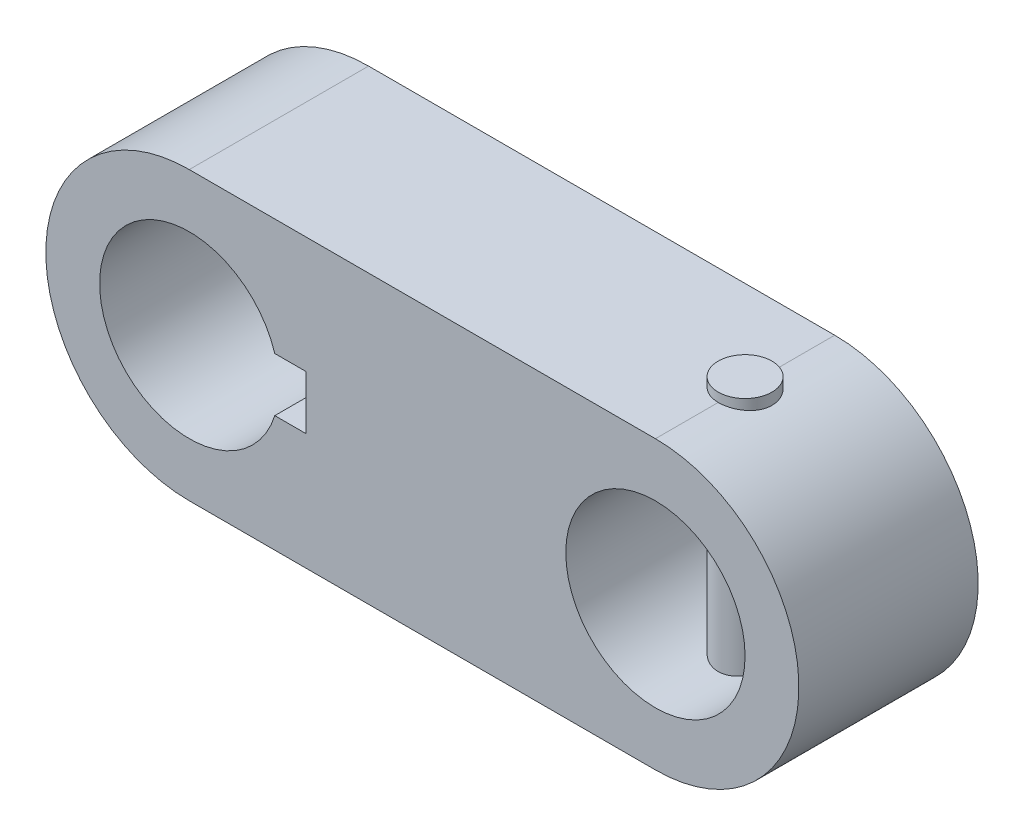
ISO-10303-21;
HEADER;
FILE_DESCRIPTION(('STEP AP214'),'2;1');
FILE_NAME('part.step','',(''),(''),'','','');
FILE_SCHEMA(('AUTOMOTIVE_DESIGN { 1 0 10303 214 1 1 1 1 }'));
ENDSEC;
DATA;
#1=APPLICATION_CONTEXT('core data for automotive mechanical design processes');
#2=APPLICATION_PROTOCOL_DEFINITION('international standard','automotive_design',2000,#1);
#3=PRODUCT_CONTEXT('',#1,'mechanical');
#4=PRODUCT('Part','Part','',(#3));
#5=PRODUCT_RELATED_PRODUCT_CATEGORY('part','',(#4));
#6=PRODUCT_DEFINITION_FORMATION('','',#4);
#7=PRODUCT_DEFINITION_CONTEXT('part definition',#1,'design');
#8=PRODUCT_DEFINITION('design','',#6,#7);
#9=PRODUCT_DEFINITION_SHAPE('','',#8);
#10=(LENGTH_UNIT() NAMED_UNIT(*) SI_UNIT(.MILLI.,.METRE.));
#11=(NAMED_UNIT(*) PLANE_ANGLE_UNIT() SI_UNIT($,.RADIAN.));
#12=(NAMED_UNIT(*) SI_UNIT($,.STERADIAN.) SOLID_ANGLE_UNIT());
#13=UNCERTAINTY_MEASURE_WITH_UNIT(LENGTH_MEASURE(1.E-05),#10,'distance_accuracy_value','');
#14=(GEOMETRIC_REPRESENTATION_CONTEXT(3) GLOBAL_UNCERTAINTY_ASSIGNED_CONTEXT((#13)) GLOBAL_UNIT_ASSIGNED_CONTEXT((#10,
#11,#12)) REPRESENTATION_CONTEXT('',''));
#15=CARTESIAN_POINT('',(0.,0.,0.));
#16=DIRECTION('',(0.,0.,1.));
#17=DIRECTION('',(1.,0.,0.));
#18=AXIS2_PLACEMENT_3D('',#15,#16,#17);
#19=CARTESIAN_POINT('',(13.,8.5,0.));
#20=DIRECTION('',(0.,-1.,0.));
#21=DIRECTION('',(0.,0.,-1.));
#22=AXIS2_PLACEMENT_3D('',#19,#20,#21);
#23=CYLINDRICAL_SURFACE('',#22,1.5);
#24=CARTESIAN_POINT('',(13.,8.5,0.));
#25=DIRECTION('',(0.,1.,0.));
#26=DIRECTION('',(0.,0.,1.));
#27=AXIS2_PLACEMENT_3D('',#24,#25,#26);
#28=CIRCLE('',#27,1.5);
#29=CARTESIAN_POINT('',(13.,8.5,1.5));
#30=VERTEX_POINT('',#29);
#31=EDGE_CURVE('E11',#30,#30,#28,.T.);
#32=ORIENTED_EDGE('',*,*,#31,.F.);
#33=EDGE_LOOP('',(#32));
#34=FACE_BOUND('',#33,.T.);
#35=CARTESIAN_POINT('',(13.,-8.5,0.));
#36=DIRECTION('',(0.,1.,0.));
#37=DIRECTION('',(0.,0.,1.));
#38=AXIS2_PLACEMENT_3D('',#35,#36,#37);
#39=CIRCLE('',#38,1.5);
#40=CARTESIAN_POINT('',(13.,-8.5,1.5));
#41=VERTEX_POINT('',#40);
#42=EDGE_CURVE('E47',#41,#41,#39,.T.);
#43=ORIENTED_EDGE('',*,*,#42,.T.);
#44=EDGE_LOOP('',(#43));
#45=FACE_BOUND('',#44,.T.);
#46=ADVANCED_FACE('F44',(#34,#45),#23,.T.);
#47=CARTESIAN_POINT('',(13.,8.5,0.));
#48=DIRECTION('',(0.,1.,0.));
#49=DIRECTION('',(0.,0.,1.));
#50=AXIS2_PLACEMENT_3D('',#47,#48,#49);
#51=PLANE('',#50);
#52=ORIENTED_EDGE('',*,*,#31,.T.);
#53=EDGE_LOOP('',(#52));
#54=FACE_BOUND('',#53,.T.);
#55=ADVANCED_FACE('F59',(#54),#51,.T.);
#56=CARTESIAN_POINT('',(13.,-8.5,0.));
#57=DIRECTION('',(0.,1.,0.));
#58=DIRECTION('',(0.,0.,1.));
#59=AXIS2_PLACEMENT_3D('',#56,#57,#58);
#60=PLANE('',#59);
#61=ORIENTED_EDGE('',*,*,#42,.F.);
#62=EDGE_LOOP('',(#61));
#63=FACE_BOUND('',#62,.T.);
#64=ADVANCED_FACE('F57',(#63),#60,.F.);
#65=CLOSED_SHELL('',(#46,#55,#64));
#66=MANIFOLD_SOLID_BREP('B2',#65);
#67=CARTESIAN_POINT('',(-13.,0.,5.));
#68=DIRECTION('',(0.,0.,-1.));
#69=DIRECTION('',(-1.,0.,0.));
#70=AXIS2_PLACEMENT_3D('',#67,#68,#69);
#71=PLANE('',#70);
#72=CARTESIAN_POINT('',(13.,0.,5.));
#73=DIRECTION('',(0.,0.,1.));
#74=DIRECTION('',(1.,0.,0.));
#75=AXIS2_PLACEMENT_3D('',#72,#73,#74);
#76=CIRCLE('',#75,5.);
#77=CARTESIAN_POINT('',(18.,0.,5.));
#78=VERTEX_POINT('',#77);
#79=EDGE_CURVE('E239',#78,#78,#76,.T.);
#80=ORIENTED_EDGE('',*,*,#79,.F.);
#81=EDGE_LOOP('',(#80));
#82=FACE_BOUND('',#81,.T.);
#83=CARTESIAN_POINT('',(-13.,0.,5.));
#84=DIRECTION('',(0.,0.,1.));
#85=DIRECTION('',(-1.,0.,0.));
#86=AXIS2_PLACEMENT_3D('',#83,#84,#85);
#87=CIRCLE('',#86,8.00000000000001);
#88=CARTESIAN_POINT('',(-12.9999999999999,7.99999999999999,5.));
#89=VERTEX_POINT('',#88);
#90=CARTESIAN_POINT('',(-13.,-8.00000000000003,5.));
#91=VERTEX_POINT('',#90);
#92=EDGE_CURVE('E243',#89,#91,#87,.T.);
#93=ORIENTED_EDGE('',*,*,#92,.T.);
#94=DIRECTION('',(1.,0.,0.));
#95=VECTOR('',#94,1.);
#96=CARTESIAN_POINT('',(13.,-8.00000000000003,5.));
#97=LINE('',#96,#95);
#98=CARTESIAN_POINT('',(13.,-8.00000000000003,5.));
#99=VERTEX_POINT('',#98);
#100=EDGE_CURVE('E288',#91,#99,#97,.T.);
#101=ORIENTED_EDGE('',*,*,#100,.T.);
#102=CARTESIAN_POINT('',(13.,0.,5.));
#103=DIRECTION('',(0.,0.,1.));
#104=DIRECTION('',(1.,0.,0.));
#105=AXIS2_PLACEMENT_3D('',#102,#103,#104);
#106=CIRCLE('',#105,8.00000000000001);
#107=CARTESIAN_POINT('',(13.,8.00000000000001,5.));
#108=VERTEX_POINT('',#107);
#109=EDGE_CURVE('E183',#99,#108,#106,.T.);
#110=ORIENTED_EDGE('',*,*,#109,.T.);
#111=DIRECTION('',(-1.,0.,0.));
#112=VECTOR('',#111,1.);
#113=CARTESIAN_POINT('',(13.,7.99999999999999,5.));
#114=LINE('',#113,#112);
#115=EDGE_CURVE('E292',#108,#89,#114,.T.);
#116=ORIENTED_EDGE('',*,*,#115,.T.);
#117=EDGE_LOOP('',(#93,#101,#110,#116));
#118=FACE_BOUND('',#117,.T.);
#119=DIRECTION('',(0.,1.,0.));
#120=VECTOR('',#119,1.);
#121=CARTESIAN_POINT('',(-6.50000000000003,1.5,5.));
#122=LINE('',#121,#120);
#123=CARTESIAN_POINT('',(-6.50000000000003,-1.5,5.));
#124=VERTEX_POINT('',#123);
#125=CARTESIAN_POINT('',(-6.50000000000003,1.5,5.));
#126=VERTEX_POINT('',#125);
#127=EDGE_CURVE('E248',#124,#126,#122,.T.);
#128=ORIENTED_EDGE('',*,*,#127,.F.);
#129=DIRECTION('',(1.,0.,0.));
#130=VECTOR('',#129,1.);
#131=CARTESIAN_POINT('',(-8.2303039929153,-1.5,5.));
#132=LINE('',#131,#130);
#133=CARTESIAN_POINT('',(-8.2303039929153,-1.5,5.));
#134=VERTEX_POINT('',#133);
#135=EDGE_CURVE('E250',#134,#124,#132,.T.);
#136=ORIENTED_EDGE('',*,*,#135,.F.);
#137=CARTESIAN_POINT('',(-13.,0.,5.));
#138=DIRECTION('',(0.,0.,1.));
#139=DIRECTION('',(1.,0.,0.));
#140=AXIS2_PLACEMENT_3D('',#137,#138,#139);
#141=CIRCLE('',#140,5.);
#142=CARTESIAN_POINT('',(-8.2303039929153,1.5,5.));
#143=VERTEX_POINT('',#142);
#144=EDGE_CURVE('E257',#143,#134,#141,.T.);
#145=ORIENTED_EDGE('',*,*,#144,.F.);
#146=DIRECTION('',(-1.,0.,0.));
#147=VECTOR('',#146,1.);
#148=CARTESIAN_POINT('',(-8.2303039929153,1.5,5.));
#149=LINE('',#148,#147);
#150=EDGE_CURVE('E251',#126,#143,#149,.T.);
#151=ORIENTED_EDGE('',*,*,#150,.F.);
#152=EDGE_LOOP('',(#128,#136,#145,#151));
#153=FACE_BOUND('',#152,.T.);
#154=ADVANCED_FACE('F84',(#82,#118,#153),#71,.F.);
#155=CARTESIAN_POINT('',(-13.,0.,-5.));
#156=DIRECTION('',(0.,0.,-1.));
#157=DIRECTION('',(-1.,0.,0.));
#158=AXIS2_PLACEMENT_3D('',#155,#156,#157);
#159=PLANE('',#158);
#160=CARTESIAN_POINT('',(-13.,0.,-5.));
#161=DIRECTION('',(0.,0.,1.));
#162=DIRECTION('',(-1.,0.,0.));
#163=AXIS2_PLACEMENT_3D('',#160,#161,#162);
#164=CIRCLE('',#163,8.00000000000001);
#165=CARTESIAN_POINT('',(-12.9999999999999,7.99999999999999,-5.));
#166=VERTEX_POINT('',#165);
#167=CARTESIAN_POINT('',(-13.,-8.00000000000003,-5.));
#168=VERTEX_POINT('',#167);
#169=EDGE_CURVE('E284',#166,#168,#164,.T.);
#170=ORIENTED_EDGE('',*,*,#169,.F.);
#171=DIRECTION('',(-1.,0.,0.));
#172=VECTOR('',#171,1.);
#173=CARTESIAN_POINT('',(13.,7.99999999999999,-5.));
#174=LINE('',#173,#172);
#175=CARTESIAN_POINT('',(13.,8.00000000000001,-5.));
#176=VERTEX_POINT('',#175);
#177=EDGE_CURVE('E289',#176,#166,#174,.T.);
#178=ORIENTED_EDGE('',*,*,#177,.F.);
#179=CARTESIAN_POINT('',(13.,0.,-5.));
#180=DIRECTION('',(0.,0.,1.));
#181=DIRECTION('',(1.,0.,0.));
#182=AXIS2_PLACEMENT_3D('',#179,#180,#181);
#183=CIRCLE('',#182,8.00000000000001);
#184=CARTESIAN_POINT('',(13.,-8.00000000000003,-5.));
#185=VERTEX_POINT('',#184);
#186=EDGE_CURVE('E299',#185,#176,#183,.T.);
#187=ORIENTED_EDGE('',*,*,#186,.F.);
#188=DIRECTION('',(1.,0.,0.));
#189=VECTOR('',#188,1.);
#190=CARTESIAN_POINT('',(13.,-8.00000000000003,-5.));
#191=LINE('',#190,#189);
#192=EDGE_CURVE('E297',#168,#185,#191,.T.);
#193=ORIENTED_EDGE('',*,*,#192,.F.);
#194=EDGE_LOOP('',(#170,#178,#187,#193));
#195=FACE_BOUND('',#194,.T.);
#196=CARTESIAN_POINT('',(13.,0.,-5.));
#197=DIRECTION('',(0.,0.,1.));
#198=DIRECTION('',(1.,0.,0.));
#199=AXIS2_PLACEMENT_3D('',#196,#197,#198);
#200=CIRCLE('',#199,5.);
#201=CARTESIAN_POINT('',(18.,0.,-5.));
#202=VERTEX_POINT('',#201);
#203=EDGE_CURVE('E282',#202,#202,#200,.T.);
#204=ORIENTED_EDGE('',*,*,#203,.T.);
#205=EDGE_LOOP('',(#204));
#206=FACE_BOUND('',#205,.T.);
#207=DIRECTION('',(1.,0.,0.));
#208=VECTOR('',#207,1.);
#209=CARTESIAN_POINT('',(-8.2303039929153,-1.5,-5.));
#210=LINE('',#209,#208);
#211=CARTESIAN_POINT('',(-8.2303039929153,-1.5,-5.));
#212=VERTEX_POINT('',#211);
#213=CARTESIAN_POINT('',(-6.50000000000003,-1.5,-5.));
#214=VERTEX_POINT('',#213);
#215=EDGE_CURVE('E256',#212,#214,#210,.T.);
#216=ORIENTED_EDGE('',*,*,#215,.T.);
#217=DIRECTION('',(0.,1.,0.));
#218=VECTOR('',#217,1.);
#219=CARTESIAN_POINT('',(-6.50000000000003,1.5,-5.));
#220=LINE('',#219,#218);
#221=CARTESIAN_POINT('',(-6.50000000000003,1.5,-5.));
#222=VERTEX_POINT('',#221);
#223=EDGE_CURVE('E170',#214,#222,#220,.T.);
#224=ORIENTED_EDGE('',*,*,#223,.T.);
#225=DIRECTION('',(-1.,0.,0.));
#226=VECTOR('',#225,1.);
#227=CARTESIAN_POINT('',(-8.2303039929153,1.5,-5.));
#228=LINE('',#227,#226);
#229=CARTESIAN_POINT('',(-8.2303039929153,1.5,-5.));
#230=VERTEX_POINT('',#229);
#231=EDGE_CURVE('E269',#222,#230,#228,.T.);
#232=ORIENTED_EDGE('',*,*,#231,.T.);
#233=CARTESIAN_POINT('',(-13.,0.,-5.));
#234=DIRECTION('',(0.,0.,1.));
#235=DIRECTION('',(1.,0.,0.));
#236=AXIS2_PLACEMENT_3D('',#233,#234,#235);
#237=CIRCLE('',#236,5.);
#238=EDGE_CURVE('E260',#230,#212,#237,.T.);
#239=ORIENTED_EDGE('',*,*,#238,.T.);
#240=EDGE_LOOP('',(#216,#224,#232,#239));
#241=FACE_BOUND('',#240,.T.);
#242=ADVANCED_FACE('F228',(#195,#206,#241),#159,.T.);
#243=CARTESIAN_POINT('',(-13.,0.,5.));
#244=DIRECTION('',(0.,0.,-1.));
#245=DIRECTION('',(-1.,0.,0.));
#246=AXIS2_PLACEMENT_3D('',#243,#244,#245);
#247=CYLINDRICAL_SURFACE('',#246,8.00000000000001);
#248=ORIENTED_EDGE('',*,*,#169,.T.);
#249=DIRECTION('',(0.,0.,-1.));
#250=VECTOR('',#249,1.);
#251=CARTESIAN_POINT('',(-13.,-8.00000000000003,5.));
#252=LINE('',#251,#250);
#253=EDGE_CURVE('E42',#91,#168,#252,.T.);
#254=ORIENTED_EDGE('',*,*,#253,.F.);
#255=ORIENTED_EDGE('',*,*,#92,.F.);
#256=DIRECTION('',(0.,0.,-1.));
#257=VECTOR('',#256,1.);
#258=CARTESIAN_POINT('',(-12.9999999999999,7.99999999999999,5.));
#259=LINE('',#258,#257);
#260=EDGE_CURVE('E294',#89,#166,#259,.T.);
#261=ORIENTED_EDGE('',*,*,#260,.T.);
#262=EDGE_LOOP('',(#248,#254,#255,#261));
#263=FACE_BOUND('',#262,.T.);
#264=ADVANCED_FACE('F86',(#263),#247,.T.);
#265=CARTESIAN_POINT('',(13.,-8.00000000000003,5.));
#266=DIRECTION('',(0.,1.,0.));
#267=DIRECTION('',(0.,0.,1.));
#268=AXIS2_PLACEMENT_3D('',#265,#266,#267);
#269=PLANE('',#268);
#270=DIRECTION('',(0.,0.,-1.));
#271=VECTOR('',#270,1.);
#272=CARTESIAN_POINT('',(13.,-8.00000000000003,5.));
#273=LINE('',#272,#271);
#274=CARTESIAN_POINT('',(13.,-8.00000000000003,-1.5));
#275=VERTEX_POINT('',#274);
#276=EDGE_CURVE('E177',#275,#185,#273,.T.);
#277=ORIENTED_EDGE('',*,*,#276,.F.);
#278=CARTESIAN_POINT('',(13.,-8.00000000000003,0.));
#279=DIRECTION('',(0.,1.,0.));
#280=DIRECTION('',(0.,0.,1.));
#281=AXIS2_PLACEMENT_3D('',#278,#279,#280);
#282=CIRCLE('',#281,1.5);
#283=CARTESIAN_POINT('',(13.,-8.00000000000003,1.5));
#284=VERTEX_POINT('',#283);
#285=EDGE_CURVE('E105',#275,#284,#282,.T.);
#286=ORIENTED_EDGE('',*,*,#285,.T.);
#287=EDGE_CURVE('E98',#99,#284,#273,.T.);
#288=ORIENTED_EDGE('',*,*,#287,.F.);
#289=ORIENTED_EDGE('',*,*,#100,.F.);
#290=ORIENTED_EDGE('',*,*,#253,.T.);
#291=ORIENTED_EDGE('',*,*,#192,.T.);
#292=EDGE_LOOP('',(#277,#286,#288,#289,#290,#291));
#293=FACE_BOUND('',#292,.T.);
#294=ADVANCED_FACE('F174',(#293),#269,.F.);
#295=CARTESIAN_POINT('',(13.,0.,5.));
#296=DIRECTION('',(0.,0.,-1.));
#297=DIRECTION('',(-1.,0.,0.));
#298=AXIS2_PLACEMENT_3D('',#295,#296,#297);
#299=CYLINDRICAL_SURFACE('',#298,8.00000000000001);
#300=ORIENTED_EDGE('',*,*,#287,.T.);
#301=CARTESIAN_POINT('',(13.,-8.00000000000001,1.5));
#302=CARTESIAN_POINT('',(13.0418117649847,-8.00000181621951,1.50000014418277));
#303=CARTESIAN_POINT('',(13.0836031516983,-7.99967179974463,1.49825066820148));
#304=CARTESIAN_POINT('',(13.1668798947577,-7.99836740024411,1.49127408384776));
#305=CARTESIAN_POINT('',(13.2083652843394,-7.99739308827258,1.48604735895251));
#306=CARTESIAN_POINT('',(13.331790086588,-7.9935384229809,1.46521493517393));
#307=CARTESIAN_POINT('',(13.4128916798455,-7.98972616594016,1.44445675593208));
#308=CARTESIAN_POINT('',(13.5703818625236,-7.98003191449903,1.38982854106838));
#309=CARTESIAN_POINT('',(13.6467696396282,-7.97414956453072,1.35595625281145));
#310=CARTESIAN_POINT('',(13.7927945330153,-7.96095806061461,1.27608762842633));
#311=CARTESIAN_POINT('',(13.8624312680283,-7.95364882615276,1.23009060809108));
#312=CARTESIAN_POINT('',(13.9937817658913,-7.93831372866161,1.12670254791103));
#313=CARTESIAN_POINT('',(14.0554036207782,-7.93028108465622,1.06919578876815));
#314=CARTESIAN_POINT('',(14.168191109011,-7.91445389199043,0.944662815450613));
#315=CARTESIAN_POINT('',(14.2193550394567,-7.90665938228175,0.877635053944912));
#316=CARTESIAN_POINT('',(14.3101513463827,-7.89212530831058,0.735311897907003));
#317=CARTESIAN_POINT('',(14.3496894614751,-7.88539456161013,0.659955390403306));
#318=CARTESIAN_POINT('',(14.4155067016361,-7.87384686023794,0.503526530397418));
#319=CARTESIAN_POINT('',(14.4417877122026,-7.86902963343565,0.422454992588525));
#320=CARTESIAN_POINT('',(14.4800503149573,-7.86192273775921,0.257885737327923));
#321=CARTESIAN_POINT('',(14.4921936177075,-7.85960450794487,0.17442687568149));
#322=CARTESIAN_POINT('',(14.5023381254315,-7.85767196290833,0.00662460729517247));
#323=CARTESIAN_POINT('',(14.5003402657489,-7.85805746885204,-0.0777187405733906));
#324=CARTESIAN_POINT('',(14.4823897670708,-7.86146293283626,-0.243719813057314));
#325=CARTESIAN_POINT('',(14.4666213959002,-7.86444810243881,-0.3253982825955));
#326=CARTESIAN_POINT('',(14.4218677868559,-7.87266186895027,-0.484928960662143));
#327=CARTESIAN_POINT('',(14.3928820789168,-7.87789054564758,-0.562781032998307));
#328=CARTESIAN_POINT('',(14.3223358879413,-7.8900386576452,-0.712989968438327));
#329=CARTESIAN_POINT('',(14.2807007908968,-7.89696807707177,-0.78531094776666));
#330=CARTESIAN_POINT('',(14.1860917834088,-7.91172998449056,-0.922006947502028));
#331=CARTESIAN_POINT('',(14.1331171101961,-7.91956253321644,-0.986381432919699));
#332=CARTESIAN_POINT('',(14.0163471767891,-7.93539895799282,-1.10641692391779));
#333=CARTESIAN_POINT('',(13.9523956100839,-7.9434035974396,-1.16192586818196));
#334=CARTESIAN_POINT('',(13.8159860964121,-7.95857194445492,-1.26146558585217));
#335=CARTESIAN_POINT('',(13.7435258172145,-7.96573542038013,-1.30549320153501));
#336=CARTESIAN_POINT('',(13.5919870014908,-7.97842982988792,-1.38084362585212));
#337=CARTESIAN_POINT('',(13.5128967456907,-7.98395779094116,-1.41214333985005));
#338=CARTESIAN_POINT('',(13.3505067690563,-7.99272942715529,-1.46092721743504));
#339=CARTESIAN_POINT('',(13.2672134831227,-7.99597648710378,-1.47843185721709));
#340=CARTESIAN_POINT('',(13.1527227143554,-7.99860062541004,-1.49252108318509));
#341=CARTESIAN_POINT('',(13.1222210188174,-7.99912490932021,-1.49532674607047));
#342=CARTESIAN_POINT('',(13.0611507436226,-7.99982426899377,-1.4990638109804));
#343=CARTESIAN_POINT('',(13.030582364102,-7.99999993339314,-1.49999837234019));
#344=CARTESIAN_POINT('',(13.,-8.00000000000001,-1.5));
#345=B_SPLINE_CURVE_WITH_KNOTS('',3,(#301,#302,#303,#304,#305,#306,#307,#308,#309,#310,#311,
#312,#313,#314,#315,#316,#317,#318,#319,#320,#321,#322,#323,#324,#325,#326,#327,#328,#329,#330,
#331,#332,#333,#334,#335,#336,#337,#338,#339,#340,#341,#342,#343,#344),.UNSPECIFIED.,.F.,.F.,(4,
2,2,2,2,2,2,2,2,2,2,2,2,2,2,2,2,2,2,2,2,4),(0.,0.125357130470065,0.250700438624284,
0.500813903064926,0.750970349038626,1.00114091453767,1.25396595140187,1.50683212391074,
1.76169530333673,2.01652222449957,2.26840481095869,2.52027073722333,2.76881712846962,
3.0173723597877,3.26742316812927,3.51749080170847,3.77147032935619,4.02551963579423,
4.28002787679103,4.53415763286603,4.62601728280353,4.71772169743777),.UNSPECIFIED.);
#346=EDGE_CURVE('E165',#284,#275,#345,.T.);
#347=ORIENTED_EDGE('',*,*,#346,.T.);
#348=ORIENTED_EDGE('',*,*,#276,.T.);
#349=ORIENTED_EDGE('',*,*,#186,.T.);
#350=DIRECTION('',(0.,0.,-1.));
#351=VECTOR('',#350,1.);
#352=CARTESIAN_POINT('',(13.,8.00000000000001,5.));
#353=LINE('',#352,#351);
#354=CARTESIAN_POINT('',(13.,7.99999999999999,-1.5));
#355=VERTEX_POINT('',#354);
#356=EDGE_CURVE('E303',#355,#176,#353,.T.);
#357=ORIENTED_EDGE('',*,*,#356,.F.);
#358=CARTESIAN_POINT('',(13.,8.00000000000001,-1.5));
#359=CARTESIAN_POINT('',(13.0418117649847,8.00000181621951,-1.50000014418277));
#360=CARTESIAN_POINT('',(13.0836031516983,7.99967179974463,-1.49825066820148));
#361=CARTESIAN_POINT('',(13.1668798947577,7.99836740024411,-1.49127408384776));
#362=CARTESIAN_POINT('',(13.2083652843393,7.99739308827258,-1.48604735895251));
#363=CARTESIAN_POINT('',(13.331790086588,7.9935384229809,-1.46521493517393));
#364=CARTESIAN_POINT('',(13.4128916798455,7.98972616594016,-1.44445675593208));
#365=CARTESIAN_POINT('',(13.5703818625236,7.98003191449903,-1.38982854106838));
#366=CARTESIAN_POINT('',(13.6467696396282,7.97414956453072,-1.35595625281145));
#367=CARTESIAN_POINT('',(13.7927945330153,7.96095806061461,-1.27608762842633));
#368=CARTESIAN_POINT('',(13.8624312680283,7.95364882615276,-1.23009060809108));
#369=CARTESIAN_POINT('',(13.9937817658913,7.93831372866161,-1.12670254791103));
#370=CARTESIAN_POINT('',(14.0554036207782,7.93028108465622,-1.06919578876815));
#371=CARTESIAN_POINT('',(14.168191109011,7.91445389199043,-0.944662815450614));
#372=CARTESIAN_POINT('',(14.2193550394567,7.90665938228175,-0.877635053944913));
#373=CARTESIAN_POINT('',(14.3101513463827,7.89212530831058,-0.735311897907004));
#374=CARTESIAN_POINT('',(14.3496894614751,7.88539456161013,-0.659955390403307));
#375=CARTESIAN_POINT('',(14.4155067016361,7.87384686023794,-0.50352653039742));
#376=CARTESIAN_POINT('',(14.4417877122026,7.86902963343565,-0.422454992588527));
#377=CARTESIAN_POINT('',(14.4800503149573,7.86192273775921,-0.257885737327925));
#378=CARTESIAN_POINT('',(14.4921936177075,7.85960450794487,-0.174426875681492));
#379=CARTESIAN_POINT('',(14.5023381254315,7.85767196290833,-0.00662460729517455));
#380=CARTESIAN_POINT('',(14.5003402657489,7.85805746885204,0.0777187405733885));
#381=CARTESIAN_POINT('',(14.4823897670708,7.86146293283626,0.243719813057311));
#382=CARTESIAN_POINT('',(14.4666213959002,7.86444810243881,0.325398282595498));
#383=CARTESIAN_POINT('',(14.4218677868559,7.87266186895027,0.484928960662141));
#384=CARTESIAN_POINT('',(14.3928820789168,7.87789054564758,0.562781032998305));
#385=CARTESIAN_POINT('',(14.3223358879413,7.8900386576452,0.712989968438325));
#386=CARTESIAN_POINT('',(14.2807007908968,7.89696807707177,0.785310947766658));
#387=CARTESIAN_POINT('',(14.1860917834088,7.91172998449056,0.922006947502027));
#388=CARTESIAN_POINT('',(14.1331171101961,7.91956253321644,0.986381432919697));
#389=CARTESIAN_POINT('',(14.0163471767891,7.93539895799282,1.10641692391779));
#390=CARTESIAN_POINT('',(13.9523956100839,7.9434035974396,1.16192586818196));
#391=CARTESIAN_POINT('',(13.8159860964121,7.95857194445492,1.26146558585217));
#392=CARTESIAN_POINT('',(13.7435258172145,7.96573542038013,1.30549320153501));
#393=CARTESIAN_POINT('',(13.5919870014908,7.97842982988792,1.38084362585212));
#394=CARTESIAN_POINT('',(13.5128967456907,7.98395779094116,1.41214333985004));
#395=CARTESIAN_POINT('',(13.3505067690563,7.99272942715529,1.46092721743504));
#396=CARTESIAN_POINT('',(13.2672134831227,7.99597648710378,1.47843185721709));
#397=CARTESIAN_POINT('',(13.1527227143554,7.99860062541004,1.49252108318509));
#398=CARTESIAN_POINT('',(13.1222210188174,7.99912490932021,1.49532674607047));
#399=CARTESIAN_POINT('',(13.0611507436226,7.99982426899377,1.4990638109804));
#400=CARTESIAN_POINT('',(13.030582364102,7.99999993339314,1.49999837234019));
#401=CARTESIAN_POINT('',(13.,8.00000000000001,1.5));
#402=B_SPLINE_CURVE_WITH_KNOTS('',3,(#358,#359,#360,#361,#362,#363,#364,#365,#366,#367,#368,
#369,#370,#371,#372,#373,#374,#375,#376,#377,#378,#379,#380,#381,#382,#383,#384,#385,#386,#387,
#388,#389,#390,#391,#392,#393,#394,#395,#396,#397,#398,#399,#400,#401),.UNSPECIFIED.,.F.,.F.,(4,
2,2,2,2,2,2,2,2,2,2,2,2,2,2,2,2,2,2,2,2,4),(0.,0.125357130470063,0.250700438624283,
0.500813903064926,0.750970349038626,1.00114091453767,1.25396595140187,1.50683212391074,
1.76169530333673,2.01652222449957,2.26840481095869,2.52027073722333,2.76881712846962,
3.0173723597877,3.26742316812927,3.51749080170847,3.77147032935619,4.02551963579423,
4.28002787679103,4.53415763286603,4.62601728280353,4.71772169743777),.UNSPECIFIED.);
#403=CARTESIAN_POINT('',(13.,8.00000000000001,1.5));
#404=VERTEX_POINT('',#403);
#405=EDGE_CURVE('E112',#355,#404,#402,.T.);
#406=ORIENTED_EDGE('',*,*,#405,.T.);
#407=EDGE_CURVE('E185',#108,#404,#353,.T.);
#408=ORIENTED_EDGE('',*,*,#407,.F.);
#409=ORIENTED_EDGE('',*,*,#109,.F.);
#410=EDGE_LOOP('',(#300,#347,#348,#349,#357,#406,#408,#409));
#411=FACE_BOUND('',#410,.T.);
#412=ADVANCED_FACE('F181',(#411),#299,.T.);
#413=CARTESIAN_POINT('',(13.,7.99999999999999,5.));
#414=DIRECTION('',(0.,-1.,0.));
#415=DIRECTION('',(0.,0.,-1.));
#416=AXIS2_PLACEMENT_3D('',#413,#414,#415);
#417=PLANE('',#416);
#418=ORIENTED_EDGE('',*,*,#407,.T.);
#419=CARTESIAN_POINT('',(13.,8.00000000000001,0.));
#420=DIRECTION('',(0.,1.,0.));
#421=DIRECTION('',(0.,0.,1.));
#422=AXIS2_PLACEMENT_3D('',#419,#420,#421);
#423=CIRCLE('',#422,1.5);
#424=EDGE_CURVE('E179',#355,#404,#423,.T.);
#425=ORIENTED_EDGE('',*,*,#424,.F.);
#426=ORIENTED_EDGE('',*,*,#356,.T.);
#427=ORIENTED_EDGE('',*,*,#177,.T.);
#428=ORIENTED_EDGE('',*,*,#260,.F.);
#429=ORIENTED_EDGE('',*,*,#115,.F.);
#430=EDGE_LOOP('',(#418,#425,#426,#427,#428,#429));
#431=FACE_BOUND('',#430,.T.);
#432=ADVANCED_FACE('F221',(#431),#417,.F.);
#433=CARTESIAN_POINT('',(13.,0.,5.));
#434=DIRECTION('',(0.,0.,-1.));
#435=DIRECTION('',(-1.,0.,0.));
#436=AXIS2_PLACEMENT_3D('',#433,#434,#435);
#437=CYLINDRICAL_SURFACE('',#436,5.);
#438=CARTESIAN_POINT('',(13.,-5.,1.5));
#439=CARTESIAN_POINT('',(13.0822886127533,-4.9999992925055,1.49999900251511));
#440=CARTESIAN_POINT('',(13.1645873183515,-4.99794915693954,1.49320613637603));
#441=CARTESIAN_POINT('',(13.3267881253048,-4.98997105593691,1.4662786457779));
#442=CARTESIAN_POINT('',(13.4066895044114,-4.98404193389692,1.44614004197666));
#443=CARTESIAN_POINT('',(13.5617327077545,-4.96895552501836,1.39325398308974));
#444=CARTESIAN_POINT('',(13.6368813643953,-4.95980300250425,1.36052513038106));
#445=CARTESIAN_POINT('',(13.7806241810531,-4.93922109237645,1.28346390694416));
#446=CARTESIAN_POINT('',(13.8492174674696,-4.92779140192067,1.23912999260458));
#447=CARTESIAN_POINT('',(13.9798717971837,-4.90350737192774,1.13877599252733));
#448=CARTESIAN_POINT('',(14.0417180712443,-4.89062383657036,1.08248337411409));
#449=CARTESIAN_POINT('',(14.1552492092332,-4.86505834210442,0.960390770089817));
#450=CARTESIAN_POINT('',(14.2069323632744,-4.85237641724501,0.894589187875041));
#451=CARTESIAN_POINT('',(14.299800377237,-4.82834113993772,0.753529246962389));
#452=CARTESIAN_POINT('',(14.3407230902221,-4.81702406663875,0.678091539009263));
#453=CARTESIAN_POINT('',(14.4092139477476,-4.79743620394031,0.521010745769708));
#454=CARTESIAN_POINT('',(14.4367852991997,-4.78916468313311,0.439369156072026));
#455=CARTESIAN_POINT('',(14.4770163368265,-4.77690870838434,0.274609733869542));
#456=CARTESIAN_POINT('',(14.4900719623467,-4.77281069324533,0.191597256136058));
#457=CARTESIAN_POINT('',(14.5021373061467,-4.76902789749767,0.024466843783235));
#458=CARTESIAN_POINT('',(14.5011504276108,-4.76934204760571,-0.059650818059087));
#459=CARTESIAN_POINT('',(14.4854697719981,-4.77424744067778,-0.223383908608483));
#460=CARTESIAN_POINT('',(14.4712720526268,-4.7786838859914,-0.303052250362238));
#461=CARTESIAN_POINT('',(14.4303742042705,-4.79108356228624,-0.45881978627346));
#462=CARTESIAN_POINT('',(14.4036728414164,-4.79904714132351,-0.534918627374332));
#463=CARTESIAN_POINT('',(14.3381602665368,-4.81772733074973,-0.682600349660739));
#464=CARTESIAN_POINT('',(14.2991881693464,-4.82848016115952,-0.754107083955262));
#465=CARTESIAN_POINT('',(14.2103522258868,-4.85150987000065,-0.889732022010192));
#466=CARTESIAN_POINT('',(14.1604857400259,-4.86378711746991,-0.953848429413777));
#467=CARTESIAN_POINT('',(14.0488129076554,-4.88911011297937,-1.07568619076202));
#468=CARTESIAN_POINT('',(13.9865949074669,-4.90216654310498,-1.13302866402967));
#469=CARTESIAN_POINT('',(13.8532632593139,-4.92712244063259,-1.23655398406425));
#470=CARTESIAN_POINT('',(13.7821490518609,-4.9390218351841,-1.28273612841443));
#471=CARTESIAN_POINT('',(13.6323550383428,-4.9604316006947,-1.36285992246473));
#472=CARTESIAN_POINT('',(13.5536277497479,-4.96992543668314,-1.39671751624986));
#473=CARTESIAN_POINT('',(13.3912454156035,-4.98533521832222,-1.45059959009963));
#474=CARTESIAN_POINT('',(13.3075917515896,-4.99125216186999,-1.47062792853249));
#475=CARTESIAN_POINT('',(13.1409522426683,-4.99868364643538,-1.49565217789939));
#476=CARTESIAN_POINT('',(13.0580500976012,-5.0003485041779,-1.50116158580161));
#477=CARTESIAN_POINT('',(12.8925003941766,-4.9995292324176,-1.49843084428792));
#478=CARTESIAN_POINT('',(12.8098528033092,-4.99704565677756,-1.49019253034856));
#479=CARTESIAN_POINT('',(12.6490963946903,-4.98830696987163,-1.4606153888885));
#480=CARTESIAN_POINT('',(12.5709272273858,-4.98213829799417,-1.43957661241913));
#481=CARTESIAN_POINT('',(12.4192453610454,-4.96674347841533,-1.3853567672218));
#482=CARTESIAN_POINT('',(12.3457332229744,-4.95751696321085,-1.35217423896214));
#483=CARTESIAN_POINT('',(12.2035628105389,-4.93669654351325,-1.27374683451887));
#484=CARTESIAN_POINT('',(12.1350561738003,-4.92505280829675,-1.22824065905203));
#485=CARTESIAN_POINT('',(12.0064766920198,-4.90073468764318,-1.12677524594719));
#486=CARTESIAN_POINT('',(11.946405967644,-4.8880600443108,-1.07081338811233));
#487=CARTESIAN_POINT('',(11.8341425544897,-4.86253171869138,-0.947612691630656));
#488=CARTESIAN_POINT('',(11.7823151876849,-4.84968825033268,-0.880038124228265));
#489=CARTESIAN_POINT('',(11.6907100492784,-4.82576515238464,-0.736872060986469));
#490=CARTESIAN_POINT('',(11.6509319617053,-4.81468547654651,-0.661280775441787));
#491=CARTESIAN_POINT('',(11.5848265287283,-4.79567189615055,-0.504467508745313));
#492=CARTESIAN_POINT('',(11.5584365306295,-4.78772337843827,-0.42327381346341));
#493=CARTESIAN_POINT('',(11.5197826918488,-4.77591594362794,-0.257312031068523));
#494=CARTESIAN_POINT('',(11.5075140102122,-4.772055625083,-0.172545179212332));
#495=CARTESIAN_POINT('',(11.4977801551494,-4.76899972496087,-0.00563848162377307));
#496=CARTESIAN_POINT('',(11.4997194469151,-4.76961647442754,0.0764636510175854));
#497=CARTESIAN_POINT('',(11.5169249455518,-4.77499401288294,0.2391141033728));
#498=CARTESIAN_POINT('',(11.5321906187528,-4.77975463592551,0.319662485176353));
#499=CARTESIAN_POINT('',(11.5752311119586,-4.79275763670385,0.475945399142851));
#500=CARTESIAN_POINT('',(11.6028482449293,-4.80095604545965,0.551727287361693));
#501=CARTESIAN_POINT('',(11.6696849287887,-4.81990278909136,0.697642438817723));
#502=CARTESIAN_POINT('',(11.7089067003712,-4.83065161194312,0.767774617640756));
#503=CARTESIAN_POINT('',(11.7995123619492,-4.85397676425833,0.903163116527112));
#504=CARTESIAN_POINT('',(11.85128723907,-4.86660540163798,0.968148761260411));
#505=CARTESIAN_POINT('',(11.9648256537022,-4.89201320450026,1.08870249830786));
#506=CARTESIAN_POINT('',(12.0265917828655,-4.90479240823905,1.14426813946776));
#507=CARTESIAN_POINT('',(12.1605342378167,-4.92950936570649,1.24602341229503));
#508=CARTESIAN_POINT('',(12.2329621142094,-4.94141159765674,1.29189144685549));
#509=CARTESIAN_POINT('',(12.3848586260164,-4.96260680455813,1.37073516990402));
#510=CARTESIAN_POINT('',(12.464323947001,-4.97190099931067,1.40371688827451));
#511=CARTESIAN_POINT('',(12.6192422873447,-4.98602174969301,1.45289527565275));
#512=CARTESIAN_POINT('',(12.6942130380457,-4.99122027381068,1.47051167288325));
#513=CARTESIAN_POINT('',(12.8461198047692,-4.99820944494492,1.49406352524158));
#514=CARTESIAN_POINT('',(12.9230554901418,-5.0000006615474,1.50000093270482));
#515=CARTESIAN_POINT('',(13.,-5.,1.5));
#516=B_SPLINE_CURVE_WITH_KNOTS('',3,(#438,#439,#440,#441,#442,#443,#444,#445,#446,#447,#448,
#449,#450,#451,#452,#453,#454,#455,#456,#457,#458,#459,#460,#461,#462,#463,#464,#465,#466,#467,
#468,#469,#470,#471,#472,#473,#474,#475,#476,#477,#478,#479,#480,#481,#482,#483,#484,#485,#486,
#487,#488,#489,#490,#491,#492,#493,#494,#495,#496,#497,#498,#499,#500,#501,#502,#503,#504,#505,
#506,#507,#508,#509,#510,#511,#512,#513,#514,#515),.UNSPECIFIED.,.T.,.F.,(4,2,2,2,2,2,2,2,2,2,2,
2,2,2,2,2,2,2,2,2,2,2,2,2,2,2,2,2,2,2,2,2,2,2,2,2,2,2,4),(0.,0.246583203612609,
0.493239964845999,0.739533676300875,0.985860164412702,1.23855602948191,1.49129437288633,
1.74971481004109,2.00807314543224,2.25919689356599,2.51025978319089,2.75226016697676,
2.99428443658001,3.23962426447119,3.48502360158555,3.74067104048167,3.99633456531071,
4.25371046881688,4.51101453528808,4.75908809438545,5.00712853550327,5.24956746682327,
5.49203554593728,5.74011305702908,5.98825282000191,6.24540400322818,6.5025484425268,
6.75847814951252,7.01432009460283,7.25950155466943,7.504673196616,7.74680040402721,
7.98897397553107,8.23996925679931,8.49102974897502,8.74942996156671,9.00770911595235,
9.2383169193046,9.46888616948875),.UNSPECIFIED.);
#517=CARTESIAN_POINT('',(13.,-5.,1.5));
#518=VERTEX_POINT('',#517);
#519=EDGE_CURVE('E88',#518,#518,#516,.T.);
#520=ORIENTED_EDGE('',*,*,#519,.F.);
#521=EDGE_LOOP('',(#520));
#522=FACE_BOUND('',#521,.T.);
#523=CARTESIAN_POINT('',(13.,5.,1.5));
#524=CARTESIAN_POINT('',(12.9177113872467,4.9999992925055,1.49999900251511));
#525=CARTESIAN_POINT('',(12.8354126816484,4.99794915693954,1.49320613637603));
#526=CARTESIAN_POINT('',(12.6732118746951,4.98997105593691,1.4662786457779));
#527=CARTESIAN_POINT('',(12.5933104955886,4.98404193389692,1.44614004197666));
#528=CARTESIAN_POINT('',(12.4382672922454,4.96895552501836,1.39325398308974));
#529=CARTESIAN_POINT('',(12.3631186356046,4.95980300250425,1.36052513038106));
#530=CARTESIAN_POINT('',(12.2193758189468,4.93922109237645,1.28346390694416));
#531=CARTESIAN_POINT('',(12.1507825325303,4.92779140192067,1.23912999260458));
#532=CARTESIAN_POINT('',(12.0201282028162,4.90350737192774,1.13877599252733));
#533=CARTESIAN_POINT('',(11.9582819287556,4.89062383657036,1.08248337411409));
#534=CARTESIAN_POINT('',(11.8447507907667,4.86505834210442,0.960390770089817));
#535=CARTESIAN_POINT('',(11.7930676367256,4.85237641724501,0.894589187875041));
#536=CARTESIAN_POINT('',(11.7001996227629,4.82834113993772,0.753529246962389));
#537=CARTESIAN_POINT('',(11.6592769097778,4.81702406663875,0.678091539009263));
#538=CARTESIAN_POINT('',(11.5907860522524,4.79743620394031,0.521010745769708));
#539=CARTESIAN_POINT('',(11.5632147008002,4.78916468313311,0.439369156072026));
#540=CARTESIAN_POINT('',(11.5229836631735,4.77690870838434,0.274609733869542));
#541=CARTESIAN_POINT('',(11.5099280376532,4.77281069324533,0.191597256136058));
#542=CARTESIAN_POINT('',(11.4978626938532,4.76902789749767,0.024466843783235));
#543=CARTESIAN_POINT('',(11.4988495723892,4.76934204760571,-0.059650818059087));
#544=CARTESIAN_POINT('',(11.5145302280019,4.77424744067778,-0.223383908608483));
#545=CARTESIAN_POINT('',(11.5287279473731,4.7786838859914,-0.303052250362238));
#546=CARTESIAN_POINT('',(11.5696257957294,4.79108356228624,-0.45881978627346));
#547=CARTESIAN_POINT('',(11.5963271585836,4.79904714132351,-0.534918627374332));
#548=CARTESIAN_POINT('',(11.6618397334632,4.81772733074973,-0.682600349660739));
#549=CARTESIAN_POINT('',(11.7008118306535,4.82848016115952,-0.754107083955262));
#550=CARTESIAN_POINT('',(11.7896477741131,4.85150987000065,-0.889732022010192));
#551=CARTESIAN_POINT('',(11.8395142599741,4.86378711746991,-0.953848429413777));
#552=CARTESIAN_POINT('',(11.9511870923445,4.88911011297937,-1.07568619076202));
#553=CARTESIAN_POINT('',(12.013405092533,4.90216654310498,-1.13302866402967));
#554=CARTESIAN_POINT('',(12.146736740686,4.92712244063259,-1.23655398406425));
#555=CARTESIAN_POINT('',(12.2178509481391,4.9390218351841,-1.28273612841443));
#556=CARTESIAN_POINT('',(12.3676449616572,4.9604316006947,-1.36285992246473));
#557=CARTESIAN_POINT('',(12.446372250252,4.96992543668314,-1.39671751624986));
#558=CARTESIAN_POINT('',(12.6087545843965,4.98533521832222,-1.45059959009963));
#559=CARTESIAN_POINT('',(12.6924082484104,4.99125216186999,-1.47062792853249));
#560=CARTESIAN_POINT('',(12.8590477573316,4.99868364643538,-1.49565217789939));
#561=CARTESIAN_POINT('',(12.9419499023988,5.0003485041779,-1.50116158580161));
#562=CARTESIAN_POINT('',(13.1074996058234,4.9995292324176,-1.49843084428792));
#563=CARTESIAN_POINT('',(13.1901471966908,4.99704565677756,-1.49019253034856));
#564=CARTESIAN_POINT('',(13.3509036053097,4.98830696987163,-1.4606153888885));
#565=CARTESIAN_POINT('',(13.4290727726141,4.98213829799417,-1.43957661241913));
#566=CARTESIAN_POINT('',(13.5807546389545,4.96674347841533,-1.3853567672218));
#567=CARTESIAN_POINT('',(13.6542667770256,4.95751696321085,-1.35217423896214));
#568=CARTESIAN_POINT('',(13.796437189461,4.93669654351325,-1.27374683451887));
#569=CARTESIAN_POINT('',(13.8649438261996,4.92505280829675,-1.22824065905203));
#570=CARTESIAN_POINT('',(13.9935233079801,4.90073468764318,-1.12677524594719));
#571=CARTESIAN_POINT('',(14.0535940323559,4.8880600443108,-1.07081338811233));
#572=CARTESIAN_POINT('',(14.1658574455102,4.86253171869138,-0.947612691630655));
#573=CARTESIAN_POINT('',(14.217684812315,4.84968825033268,-0.880038124228263));
#574=CARTESIAN_POINT('',(14.3092899507215,4.82576515238463,-0.736872060986467));
#575=CARTESIAN_POINT('',(14.3490680382947,4.81468547654651,-0.661280775441786));
#576=CARTESIAN_POINT('',(14.4151734712717,4.79567189615055,-0.504467508745313));
#577=CARTESIAN_POINT('',(14.4415634693705,4.78772337843827,-0.423273813463409));
#578=CARTESIAN_POINT('',(14.4802173081511,4.77591594362794,-0.257312031068523));
#579=CARTESIAN_POINT('',(14.4924859897878,4.772055625083,-0.172545179212332));
#580=CARTESIAN_POINT('',(14.5022198448506,4.76899972496087,-0.00563848162377308));
#581=CARTESIAN_POINT('',(14.5002805530849,4.76961647442754,0.0764636510175854));
#582=CARTESIAN_POINT('',(14.4830750544481,4.77499401288294,0.2391141033728));
#583=CARTESIAN_POINT('',(14.4678093812471,4.77975463592551,0.319662485176353));
#584=CARTESIAN_POINT('',(14.4247688880413,4.79275763670385,0.475945399142851));
#585=CARTESIAN_POINT('',(14.3971517550707,4.80095604545965,0.551727287361693));
#586=CARTESIAN_POINT('',(14.3303150712113,4.81990278909136,0.697642438817723));
#587=CARTESIAN_POINT('',(14.2910932996287,4.83065161194312,0.767774617640756));
#588=CARTESIAN_POINT('',(14.2004876380507,4.85397676425833,0.903163116527112));
#589=CARTESIAN_POINT('',(14.1487127609299,4.86660540163798,0.968148761260411));
#590=CARTESIAN_POINT('',(14.0351743462978,4.89201320450026,1.08870249830786));
#591=CARTESIAN_POINT('',(13.9734082171345,4.90479240823905,1.14426813946776));
#592=CARTESIAN_POINT('',(13.8394657621832,4.92950936570649,1.24602341229503));
#593=CARTESIAN_POINT('',(13.7670378857906,4.94141159765674,1.29189144685549));
#594=CARTESIAN_POINT('',(13.6151413739835,4.96260680455813,1.37073516990403));
#595=CARTESIAN_POINT('',(13.5356760529989,4.97190099931067,1.40371688827451));
#596=CARTESIAN_POINT('',(13.3807577126553,4.98602174969301,1.45289527565275));
#597=CARTESIAN_POINT('',(13.3057869619542,4.99122027381068,1.47051167288325));
#598=CARTESIAN_POINT('',(13.1538801952307,4.99820944494492,1.49406352524158));
#599=CARTESIAN_POINT('',(13.0769445098581,5.0000006615474,1.50000093270482));
#600=CARTESIAN_POINT('',(13.,5.,1.5));
#601=B_SPLINE_CURVE_WITH_KNOTS('',3,(#523,#524,#525,#526,#527,#528,#529,#530,#531,#532,#533,
#534,#535,#536,#537,#538,#539,#540,#541,#542,#543,#544,#545,#546,#547,#548,#549,#550,#551,#552,
#553,#554,#555,#556,#557,#558,#559,#560,#561,#562,#563,#564,#565,#566,#567,#568,#569,#570,#571,
#572,#573,#574,#575,#576,#577,#578,#579,#580,#581,#582,#583,#584,#585,#586,#587,#588,#589,#590,
#591,#592,#593,#594,#595,#596,#597,#598,#599,#600),.UNSPECIFIED.,.T.,.F.,(4,2,2,2,2,2,2,2,2,2,2,
2,2,2,2,2,2,2,2,2,2,2,2,2,2,2,2,2,2,2,2,2,2,2,2,2,2,2,4),(0.,0.246583203612609,
0.493239964845999,0.739533676300875,0.985860164412702,1.23855602948191,1.49129437288633,
1.74971481004109,2.00807314543224,2.25919689356599,2.51025978319089,2.75226016697676,
2.99428443658001,3.23962426447119,3.48502360158555,3.74067104048167,3.99633456531071,
4.25371046881689,4.51101453528808,4.75908809438545,5.00712853550327,5.24956746682327,
5.49203554593728,5.74011305702908,5.98825282000191,6.24540400322819,6.50254844252681,
6.75847814951252,7.01432009460283,7.25950155466943,7.504673196616,7.74680040402721,
7.98897397553107,8.23996925679931,8.49102974897502,8.74942996156671,9.00770911595235,
9.2383169193046,9.46888616948875),.UNSPECIFIED.);
#602=CARTESIAN_POINT('',(13.,5.,1.5));
#603=VERTEX_POINT('',#602);
#604=EDGE_CURVE('E178',#603,#603,#601,.T.);
#605=ORIENTED_EDGE('',*,*,#604,.F.);
#606=EDGE_LOOP('',(#605));
#607=FACE_BOUND('',#606,.T.);
#608=ORIENTED_EDGE('',*,*,#79,.T.);
#609=EDGE_LOOP('',(#608));
#610=FACE_BOUND('',#609,.T.);
#611=ORIENTED_EDGE('',*,*,#203,.F.);
#612=EDGE_LOOP('',(#611));
#613=FACE_BOUND('',#612,.T.);
#614=ADVANCED_FACE('F192',(#522,#607,#610,#613),#437,.F.);
#615=CARTESIAN_POINT('',(-6.50000000000003,1.5,5.));
#616=DIRECTION('',(-1.,0.,0.));
#617=DIRECTION('',(0.,0.,1.));
#618=AXIS2_PLACEMENT_3D('',#615,#616,#617);
#619=PLANE('',#618);
#620=ORIENTED_EDGE('',*,*,#223,.F.);
#621=DIRECTION('',(0.,0.,-1.));
#622=VECTOR('',#621,1.);
#623=CARTESIAN_POINT('',(-6.50000000000003,-1.5,5.));
#624=LINE('',#623,#622);
#625=EDGE_CURVE('E266',#124,#214,#624,.T.);
#626=ORIENTED_EDGE('',*,*,#625,.F.);
#627=ORIENTED_EDGE('',*,*,#127,.T.);
#628=DIRECTION('',(0.,0.,-1.));
#629=VECTOR('',#628,1.);
#630=CARTESIAN_POINT('',(-6.50000000000003,1.5,5.));
#631=LINE('',#630,#629);
#632=EDGE_CURVE('E280',#126,#222,#631,.T.);
#633=ORIENTED_EDGE('',*,*,#632,.T.);
#634=EDGE_LOOP('',(#620,#626,#627,#633));
#635=FACE_BOUND('',#634,.T.);
#636=ADVANCED_FACE('F318',(#635),#619,.T.);
#637=CARTESIAN_POINT('',(-8.2303039929153,1.5,5.));
#638=DIRECTION('',(0.,-1.,0.));
#639=DIRECTION('',(0.,0.,-1.));
#640=AXIS2_PLACEMENT_3D('',#637,#638,#639);
#641=PLANE('',#640);
#642=ORIENTED_EDGE('',*,*,#231,.F.);
#643=ORIENTED_EDGE('',*,*,#632,.F.);
#644=ORIENTED_EDGE('',*,*,#150,.T.);
#645=DIRECTION('',(0.,0.,-1.));
#646=VECTOR('',#645,1.);
#647=CARTESIAN_POINT('',(-8.2303039929153,1.5,5.));
#648=LINE('',#647,#646);
#649=EDGE_CURVE('E278',#143,#230,#648,.T.);
#650=ORIENTED_EDGE('',*,*,#649,.T.);
#651=EDGE_LOOP('',(#642,#643,#644,#650));
#652=FACE_BOUND('',#651,.T.);
#653=ADVANCED_FACE('F320',(#652),#641,.T.);
#654=CARTESIAN_POINT('',(-13.,0.,5.));
#655=DIRECTION('',(0.,0.,-1.));
#656=DIRECTION('',(-1.,0.,0.));
#657=AXIS2_PLACEMENT_3D('',#654,#655,#656);
#658=CYLINDRICAL_SURFACE('',#657,5.);
#659=ORIENTED_EDGE('',*,*,#238,.F.);
#660=ORIENTED_EDGE('',*,*,#649,.F.);
#661=ORIENTED_EDGE('',*,*,#144,.T.);
#662=DIRECTION('',(0.,0.,-1.));
#663=VECTOR('',#662,1.);
#664=CARTESIAN_POINT('',(-8.2303039929153,-1.5,5.));
#665=LINE('',#664,#663);
#666=EDGE_CURVE('E276',#134,#212,#665,.T.);
#667=ORIENTED_EDGE('',*,*,#666,.T.);
#668=EDGE_LOOP('',(#659,#660,#661,#667));
#669=FACE_BOUND('',#668,.T.);
#670=ADVANCED_FACE('F323',(#669),#658,.F.);
#671=CARTESIAN_POINT('',(-8.2303039929153,-1.5,5.));
#672=DIRECTION('',(0.,1.,0.));
#673=DIRECTION('',(0.,0.,1.));
#674=AXIS2_PLACEMENT_3D('',#671,#672,#673);
#675=PLANE('',#674);
#676=ORIENTED_EDGE('',*,*,#215,.F.);
#677=ORIENTED_EDGE('',*,*,#666,.F.);
#678=ORIENTED_EDGE('',*,*,#135,.T.);
#679=ORIENTED_EDGE('',*,*,#625,.T.);
#680=EDGE_LOOP('',(#676,#677,#678,#679));
#681=FACE_BOUND('',#680,.T.);
#682=ADVANCED_FACE('F201',(#681),#675,.T.);
#683=CARTESIAN_POINT('',(13.,-8.00000000000003,0.));
#684=DIRECTION('',(0.,1.,0.));
#685=DIRECTION('',(0.,0.,1.));
#686=AXIS2_PLACEMENT_3D('',#683,#684,#685);
#687=CYLINDRICAL_SURFACE('',#686,1.5);
#688=ORIENTED_EDGE('',*,*,#604,.T.);
#689=EDGE_LOOP('',(#688));
#690=FACE_BOUND('',#689,.T.);
#691=ORIENTED_EDGE('',*,*,#424,.T.);
#692=ORIENTED_EDGE('',*,*,#405,.F.);
#693=EDGE_LOOP('',(#691,#692));
#694=FACE_BOUND('',#693,.T.);
#695=ADVANCED_FACE('F199',(#690,#694),#687,.F.);
#696=ORIENTED_EDGE('',*,*,#519,.T.);
#697=EDGE_LOOP('',(#696));
#698=FACE_BOUND('',#697,.T.);
#699=ORIENTED_EDGE('',*,*,#285,.F.);
#700=ORIENTED_EDGE('',*,*,#346,.F.);
#701=EDGE_LOOP('',(#699,#700));
#702=FACE_BOUND('',#701,.T.);
#703=ADVANCED_FACE('F166',(#698,#702),#687,.F.);
#704=CLOSED_SHELL('',(#154,#242,#264,#294,#412,#432,#614,#636,#653,#670,#682,#695,#703));
#705=MANIFOLD_SOLID_BREP('B6',#704);
#706=ADVANCED_BREP_SHAPE_REPRESENTATION('',(#18,#66,#705),#14);
#707=SHAPE_DEFINITION_REPRESENTATION(#9,#706);
ENDSEC;
END-ISO-10303-21;
